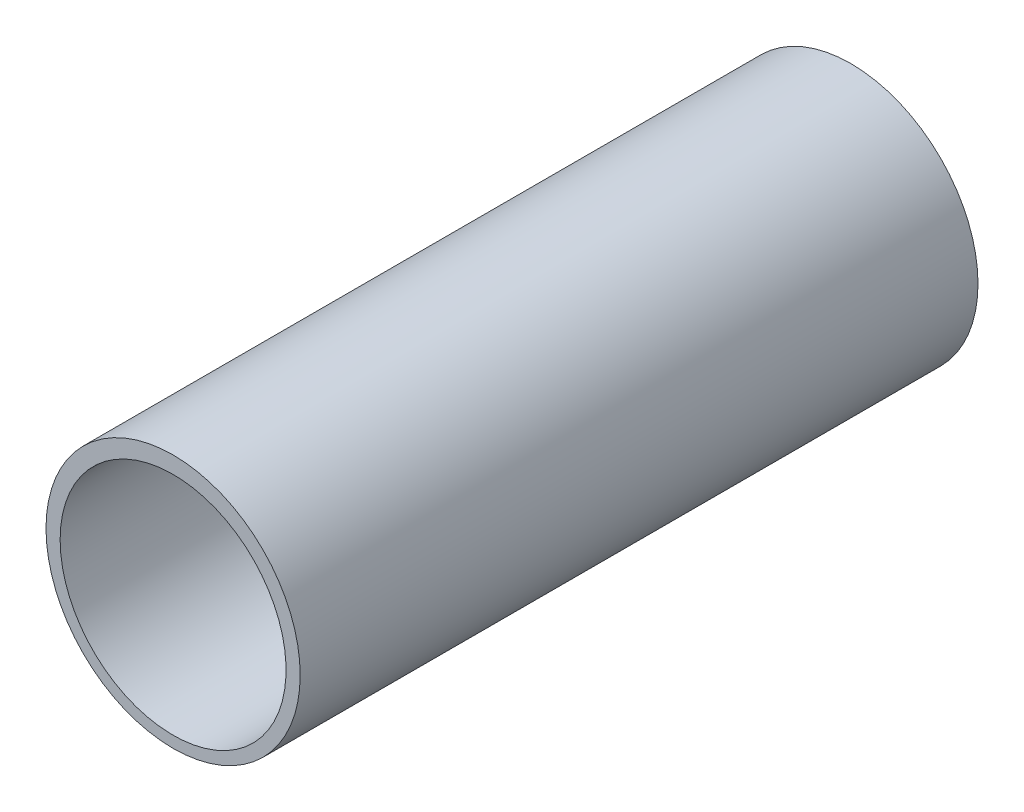
ISO-10303-21;
HEADER;
FILE_DESCRIPTION(('STEP AP214'),'2;1');
FILE_NAME('part.step','',(''),(''),'','','');
FILE_SCHEMA(('AUTOMOTIVE_DESIGN { 1 0 10303 214 1 1 1 1 }'));
ENDSEC;
DATA;
#1=APPLICATION_CONTEXT('core data for automotive mechanical design processes');
#2=APPLICATION_PROTOCOL_DEFINITION('international standard','automotive_design',2000,#1);
#3=PRODUCT_CONTEXT('',#1,'mechanical');
#4=PRODUCT('Part','Part','',(#3));
#5=PRODUCT_RELATED_PRODUCT_CATEGORY('part','',(#4));
#6=PRODUCT_DEFINITION_FORMATION('','',#4);
#7=PRODUCT_DEFINITION_CONTEXT('part definition',#1,'design');
#8=PRODUCT_DEFINITION('design','',#6,#7);
#9=PRODUCT_DEFINITION_SHAPE('','',#8);
#10=(LENGTH_UNIT() NAMED_UNIT(*) SI_UNIT(.MILLI.,.METRE.));
#11=(NAMED_UNIT(*) PLANE_ANGLE_UNIT() SI_UNIT($,.RADIAN.));
#12=(NAMED_UNIT(*) SI_UNIT($,.STERADIAN.) SOLID_ANGLE_UNIT());
#13=UNCERTAINTY_MEASURE_WITH_UNIT(LENGTH_MEASURE(1.E-05),#10,'distance_accuracy_value','');
#14=(GEOMETRIC_REPRESENTATION_CONTEXT(3) GLOBAL_UNCERTAINTY_ASSIGNED_CONTEXT((#13)) GLOBAL_UNIT_ASSIGNED_CONTEXT((#10,
#11,#12)) REPRESENTATION_CONTEXT('',''));
#15=CARTESIAN_POINT('',(0.,0.,0.));
#16=DIRECTION('',(0.,0.,1.));
#17=DIRECTION('',(1.,0.,0.));
#18=AXIS2_PLACEMENT_3D('',#15,#16,#17);
#19=CARTESIAN_POINT('',(0.,0.,304.8));
#20=DIRECTION('',(0.,0.,-1.));
#21=DIRECTION('',(-1.,0.,0.));
#22=AXIS2_PLACEMENT_3D('',#19,#20,#21);
#23=CYLINDRICAL_SURFACE('',#22,57.15);
#24=CARTESIAN_POINT('',(0.,0.,304.8));
#25=DIRECTION('',(0.,0.,1.));
#26=DIRECTION('',(1.,0.,0.));
#27=AXIS2_PLACEMENT_3D('',#24,#25,#26);
#28=CIRCLE('',#27,57.15);
#29=CARTESIAN_POINT('',(-57.15,0.,304.8));
#30=VERTEX_POINT('',#29);
#31=EDGE_CURVE('E10',#30,#30,#28,.T.);
#32=CARTESIAN_POINT('',(0.,0.,0.));
#33=DIRECTION('',(0.,0.,1.));
#34=DIRECTION('',(1.,0.,0.));
#35=AXIS2_PLACEMENT_3D('',#32,#33,#34);
#36=CIRCLE('',#35,57.15);
#37=CARTESIAN_POINT('',(-57.15,0.,0.));
#38=VERTEX_POINT('',#37);
#39=EDGE_CURVE('E44',#38,#38,#36,.T.);
#40=CARTESIAN_POINT('',(-57.15,0.,304.8));
#41=CARTESIAN_POINT('',(-57.15,0.,301.625));
#42=CARTESIAN_POINT('',(-57.15,0.,298.45));
#43=CARTESIAN_POINT('',(-57.15,0.,292.1));
#44=CARTESIAN_POINT('',(-57.15,0.,288.925));
#45=CARTESIAN_POINT('',(-57.15,0.,282.575));
#46=CARTESIAN_POINT('',(-57.15,0.,279.4));
#47=CARTESIAN_POINT('',(-57.15,0.,273.05));
#48=CARTESIAN_POINT('',(-57.15,0.,269.875));
#49=CARTESIAN_POINT('',(-57.15,0.,263.525));
#50=CARTESIAN_POINT('',(-57.15,0.,260.35));
#51=CARTESIAN_POINT('',(-57.15,0.,254.));
#52=CARTESIAN_POINT('',(-57.15,0.,250.825));
#53=CARTESIAN_POINT('',(-57.15,0.,244.475));
#54=CARTESIAN_POINT('',(-57.15,0.,241.3));
#55=CARTESIAN_POINT('',(-57.15,0.,234.95));
#56=CARTESIAN_POINT('',(-57.15,0.,231.775));
#57=CARTESIAN_POINT('',(-57.15,0.,225.425));
#58=CARTESIAN_POINT('',(-57.15,0.,222.25));
#59=CARTESIAN_POINT('',(-57.15,0.,215.9));
#60=CARTESIAN_POINT('',(-57.15,0.,212.725));
#61=CARTESIAN_POINT('',(-57.15,0.,206.375));
#62=CARTESIAN_POINT('',(-57.15,0.,203.2));
#63=CARTESIAN_POINT('',(-57.15,0.,196.85));
#64=CARTESIAN_POINT('',(-57.15,0.,193.675));
#65=CARTESIAN_POINT('',(-57.15,0.,187.325));
#66=CARTESIAN_POINT('',(-57.15,0.,184.15));
#67=CARTESIAN_POINT('',(-57.15,0.,177.8));
#68=CARTESIAN_POINT('',(-57.15,0.,174.625));
#69=CARTESIAN_POINT('',(-57.15,0.,168.275));
#70=CARTESIAN_POINT('',(-57.15,0.,165.1));
#71=CARTESIAN_POINT('',(-57.15,0.,158.75));
#72=CARTESIAN_POINT('',(-57.15,0.,155.575));
#73=CARTESIAN_POINT('',(-57.15,0.,149.225));
#74=CARTESIAN_POINT('',(-57.15,0.,146.05));
#75=CARTESIAN_POINT('',(-57.15,0.,139.7));
#76=CARTESIAN_POINT('',(-57.15,0.,136.525));
#77=CARTESIAN_POINT('',(-57.15,0.,130.175));
#78=CARTESIAN_POINT('',(-57.15,0.,127.));
#79=CARTESIAN_POINT('',(-57.15,0.,120.65));
#80=CARTESIAN_POINT('',(-57.15,0.,117.475));
#81=CARTESIAN_POINT('',(-57.15,0.,111.125));
#82=CARTESIAN_POINT('',(-57.15,0.,107.95));
#83=CARTESIAN_POINT('',(-57.15,0.,101.6));
#84=CARTESIAN_POINT('',(-57.15,0.,98.425));
#85=CARTESIAN_POINT('',(-57.15,0.,92.075));
#86=CARTESIAN_POINT('',(-57.15,0.,88.9));
#87=CARTESIAN_POINT('',(-57.15,0.,82.55));
#88=CARTESIAN_POINT('',(-57.15,0.,79.375));
#89=CARTESIAN_POINT('',(-57.15,0.,73.025));
#90=CARTESIAN_POINT('',(-57.15,0.,69.85));
#91=CARTESIAN_POINT('',(-57.15,0.,63.5));
#92=CARTESIAN_POINT('',(-57.15,0.,60.325));
#93=CARTESIAN_POINT('',(-57.15,0.,53.975));
#94=CARTESIAN_POINT('',(-57.15,0.,50.8));
#95=CARTESIAN_POINT('',(-57.15,0.,44.45));
#96=CARTESIAN_POINT('',(-57.15,0.,41.275));
#97=CARTESIAN_POINT('',(-57.15,0.,34.925));
#98=CARTESIAN_POINT('',(-57.15,0.,31.75));
#99=CARTESIAN_POINT('',(-57.15,0.,25.4));
#100=CARTESIAN_POINT('',(-57.15,0.,22.225));
#101=CARTESIAN_POINT('',(-57.15,0.,15.875));
#102=CARTESIAN_POINT('',(-57.15,0.,12.7));
#103=CARTESIAN_POINT('',(-57.15,0.,6.35));
#104=CARTESIAN_POINT('',(-57.15,0.,3.175));
#105=CARTESIAN_POINT('',(-57.15,0.,0.));
#106=B_SPLINE_CURVE_WITH_KNOTS('',3,(#40,#41,#42,#43,#44,#45,#46,#47,#48,#49,#50,#51,#52,#53,
#54,#55,#56,#57,#58,#59,#60,#61,#62,#63,#64,#65,#66,#67,#68,#69,#70,#71,#72,#73,#74,#75,#76,#77,
#78,#79,#80,#81,#82,#83,#84,#85,#86,#87,#88,#89,#90,#91,#92,#93,#94,#95,#96,#97,#98,#99,#100,
#101,#102,#103,#104,#105),.UNSPECIFIED.,.F.,.F.,(4,2,2,2,2,2,2,2,2,2,2,2,2,2,2,2,2,2,2,2,2,2,2,
2,2,2,2,2,2,2,2,2,4),(0.,9.52500000000001,19.05,28.575,38.1,47.625,57.15,66.675,76.2,
85.7250000000001,95.2500000000001,104.775,114.3,123.825,133.35,142.875,152.4,161.925,171.45,
180.975,190.5,200.025,209.55,219.075,228.6,238.125,247.65,257.175,266.7,276.225,285.75,295.275,
304.8),.UNSPECIFIED.);
#107=EDGE_CURVE('BSEAM41',#30,#38,#106,.T.);
#108=ORIENTED_EDGE('',*,*,#31,.F.);
#109=ORIENTED_EDGE('',*,*,#39,.T.);
#110=ORIENTED_EDGE('',*,*,#107,.T.);
#111=ORIENTED_EDGE('',*,*,#107,.F.);
#112=EDGE_LOOP('',(#108,#110,#109,#111));
#113=FACE_BOUND('',#112,.T.);
#114=ADVANCED_FACE('F41',(#113),#23,.T.);
#115=CARTESIAN_POINT('',(0.,0.,304.8));
#116=DIRECTION('',(0.,0.,1.));
#117=DIRECTION('',(1.,0.,0.));
#118=AXIS2_PLACEMENT_3D('',#115,#116,#117);
#119=PLANE('',#118);
#120=CARTESIAN_POINT('',(0.,-1.22481702801975,304.8));
#121=DIRECTION('',(0.,0.,-1.));
#122=DIRECTION('',(-1.,0.,0.));
#123=AXIS2_PLACEMENT_3D('',#120,#121,#122);
#124=CIRCLE('',#123,50.8);
#125=CARTESIAN_POINT('',(-50.8,-1.22481702801975,304.8));
#126=VERTEX_POINT('',#125);
#127=EDGE_CURVE('E53',#126,#126,#124,.T.);
#128=ORIENTED_EDGE('',*,*,#127,.T.);
#129=EDGE_LOOP('',(#128));
#130=FACE_BOUND('',#129,.T.);
#131=ORIENTED_EDGE('',*,*,#31,.T.);
#132=EDGE_LOOP('',(#131));
#133=FACE_BOUND('',#132,.T.);
#134=ADVANCED_FACE('F63',(#130,#133),#119,.T.);
#135=CARTESIAN_POINT('',(0.,0.,0.));
#136=DIRECTION('',(0.,0.,1.));
#137=DIRECTION('',(1.,0.,0.));
#138=AXIS2_PLACEMENT_3D('',#135,#136,#137);
#139=PLANE('',#138);
#140=CARTESIAN_POINT('',(0.,-1.22481702801975,0.));
#141=DIRECTION('',(0.,0.,-1.));
#142=DIRECTION('',(-1.,0.,0.));
#143=AXIS2_PLACEMENT_3D('',#140,#141,#142);
#144=CIRCLE('',#143,50.8);
#145=CARTESIAN_POINT('',(-50.8,-1.22481702801975,0.));
#146=VERTEX_POINT('',#145);
#147=EDGE_CURVE('E55',#146,#146,#144,.T.);
#148=ORIENTED_EDGE('',*,*,#147,.F.);
#149=EDGE_LOOP('',(#148));
#150=FACE_BOUND('',#149,.T.);
#151=ORIENTED_EDGE('',*,*,#39,.F.);
#152=EDGE_LOOP('',(#151));
#153=FACE_BOUND('',#152,.T.);
#154=ADVANCED_FACE('F68',(#150,#153),#139,.F.);
#155=CARTESIAN_POINT('',(0.,-1.22481702801975,304.8));
#156=DIRECTION('',(0.,0.,-1.));
#157=DIRECTION('',(-1.,0.,0.));
#158=AXIS2_PLACEMENT_3D('',#155,#156,#157);
#159=CYLINDRICAL_SURFACE('',#158,50.8);
#160=CARTESIAN_POINT('',(-50.8,-1.22481702801975,304.8));
#161=CARTESIAN_POINT('',(-50.8,-1.22481702801975,301.625));
#162=CARTESIAN_POINT('',(-50.8,-1.22481702801975,298.45));
#163=CARTESIAN_POINT('',(-50.8,-1.22481702801975,292.1));
#164=CARTESIAN_POINT('',(-50.8,-1.22481702801975,288.925));
#165=CARTESIAN_POINT('',(-50.8,-1.22481702801975,282.575));
#166=CARTESIAN_POINT('',(-50.8,-1.22481702801975,279.4));
#167=CARTESIAN_POINT('',(-50.8,-1.22481702801975,273.05));
#168=CARTESIAN_POINT('',(-50.8,-1.22481702801975,269.875));
#169=CARTESIAN_POINT('',(-50.8,-1.22481702801975,263.525));
#170=CARTESIAN_POINT('',(-50.8,-1.22481702801975,260.35));
#171=CARTESIAN_POINT('',(-50.8,-1.22481702801975,254.));
#172=CARTESIAN_POINT('',(-50.8,-1.22481702801975,250.825));
#173=CARTESIAN_POINT('',(-50.8,-1.22481702801975,244.475));
#174=CARTESIAN_POINT('',(-50.8,-1.22481702801975,241.3));
#175=CARTESIAN_POINT('',(-50.8,-1.22481702801975,234.95));
#176=CARTESIAN_POINT('',(-50.8,-1.22481702801975,231.775));
#177=CARTESIAN_POINT('',(-50.8,-1.22481702801975,225.425));
#178=CARTESIAN_POINT('',(-50.8,-1.22481702801975,222.25));
#179=CARTESIAN_POINT('',(-50.8,-1.22481702801975,215.9));
#180=CARTESIAN_POINT('',(-50.8,-1.22481702801975,212.725));
#181=CARTESIAN_POINT('',(-50.8,-1.22481702801975,206.375));
#182=CARTESIAN_POINT('',(-50.8,-1.22481702801975,203.2));
#183=CARTESIAN_POINT('',(-50.8,-1.22481702801975,196.85));
#184=CARTESIAN_POINT('',(-50.8,-1.22481702801975,193.675));
#185=CARTESIAN_POINT('',(-50.8,-1.22481702801975,187.325));
#186=CARTESIAN_POINT('',(-50.8,-1.22481702801975,184.15));
#187=CARTESIAN_POINT('',(-50.8,-1.22481702801975,177.8));
#188=CARTESIAN_POINT('',(-50.8,-1.22481702801975,174.625));
#189=CARTESIAN_POINT('',(-50.8,-1.22481702801975,168.275));
#190=CARTESIAN_POINT('',(-50.8,-1.22481702801975,165.1));
#191=CARTESIAN_POINT('',(-50.8,-1.22481702801975,158.75));
#192=CARTESIAN_POINT('',(-50.8,-1.22481702801975,155.575));
#193=CARTESIAN_POINT('',(-50.8,-1.22481702801975,149.225));
#194=CARTESIAN_POINT('',(-50.8,-1.22481702801975,146.05));
#195=CARTESIAN_POINT('',(-50.8,-1.22481702801975,139.7));
#196=CARTESIAN_POINT('',(-50.8,-1.22481702801975,136.525));
#197=CARTESIAN_POINT('',(-50.8,-1.22481702801975,130.175));
#198=CARTESIAN_POINT('',(-50.8,-1.22481702801975,127.));
#199=CARTESIAN_POINT('',(-50.8,-1.22481702801975,120.65));
#200=CARTESIAN_POINT('',(-50.8,-1.22481702801975,117.475));
#201=CARTESIAN_POINT('',(-50.8,-1.22481702801975,111.125));
#202=CARTESIAN_POINT('',(-50.8,-1.22481702801975,107.95));
#203=CARTESIAN_POINT('',(-50.8,-1.22481702801975,101.6));
#204=CARTESIAN_POINT('',(-50.8,-1.22481702801975,98.425));
#205=CARTESIAN_POINT('',(-50.8,-1.22481702801975,92.075));
#206=CARTESIAN_POINT('',(-50.8,-1.22481702801975,88.9));
#207=CARTESIAN_POINT('',(-50.8,-1.22481702801975,82.55));
#208=CARTESIAN_POINT('',(-50.8,-1.22481702801975,79.375));
#209=CARTESIAN_POINT('',(-50.8,-1.22481702801975,73.025));
#210=CARTESIAN_POINT('',(-50.8,-1.22481702801975,69.85));
#211=CARTESIAN_POINT('',(-50.8,-1.22481702801975,63.5));
#212=CARTESIAN_POINT('',(-50.8,-1.22481702801975,60.325));
#213=CARTESIAN_POINT('',(-50.8,-1.22481702801975,53.975));
#214=CARTESIAN_POINT('',(-50.8,-1.22481702801975,50.8));
#215=CARTESIAN_POINT('',(-50.8,-1.22481702801975,44.45));
#216=CARTESIAN_POINT('',(-50.8,-1.22481702801975,41.275));
#217=CARTESIAN_POINT('',(-50.8,-1.22481702801975,34.925));
#218=CARTESIAN_POINT('',(-50.8,-1.22481702801975,31.75));
#219=CARTESIAN_POINT('',(-50.8,-1.22481702801975,25.4));
#220=CARTESIAN_POINT('',(-50.8,-1.22481702801975,22.225));
#221=CARTESIAN_POINT('',(-50.8,-1.22481702801975,15.875));
#222=CARTESIAN_POINT('',(-50.8,-1.22481702801975,12.7));
#223=CARTESIAN_POINT('',(-50.8,-1.22481702801975,6.35));
#224=CARTESIAN_POINT('',(-50.8,-1.22481702801975,3.175));
#225=CARTESIAN_POINT('',(-50.8,-1.22481702801975,0.));
#226=B_SPLINE_CURVE_WITH_KNOTS('',3,(#160,#161,#162,#163,#164,#165,#166,#167,#168,#169,#170,
#171,#172,#173,#174,#175,#176,#177,#178,#179,#180,#181,#182,#183,#184,#185,#186,#187,#188,#189,
#190,#191,#192,#193,#194,#195,#196,#197,#198,#199,#200,#201,#202,#203,#204,#205,#206,#207,#208,
#209,#210,#211,#212,#213,#214,#215,#216,#217,#218,#219,#220,#221,#222,#223,#224,#225),
.UNSPECIFIED.,.F.,.F.,(4,2,2,2,2,2,2,2,2,2,2,2,2,2,2,2,2,2,2,2,2,2,2,2,2,2,2,2,2,2,2,2,4),(0.,
9.52500000000001,19.05,28.575,38.1,47.625,57.15,66.675,76.2,85.7250000000001,95.2500000000001,
104.775,114.3,123.825,133.35,142.875,152.4,161.925,171.45,180.975,190.5,200.025,209.55,219.075,
228.6,238.125,247.65,257.175,266.7,276.225,285.75,295.275,304.8),.UNSPECIFIED.);
#227=EDGE_CURVE('BSEAM65',#126,#146,#226,.T.);
#228=ORIENTED_EDGE('',*,*,#127,.F.);
#229=ORIENTED_EDGE('',*,*,#147,.T.);
#230=ORIENTED_EDGE('',*,*,#227,.T.);
#231=ORIENTED_EDGE('',*,*,#227,.F.);
#232=EDGE_LOOP('',(#228,#230,#229,#231));
#233=FACE_BOUND('',#232,.T.);
#234=ADVANCED_FACE('F65',(#233),#159,.F.);
#235=CLOSED_SHELL('',(#114,#134,#154,#234));
#236=MANIFOLD_SOLID_BREP('B2',#235);
#237=ADVANCED_BREP_SHAPE_REPRESENTATION('',(#18,#236),#14);
#238=SHAPE_DEFINITION_REPRESENTATION(#9,#237);
ENDSEC;
END-ISO-10303-21;
